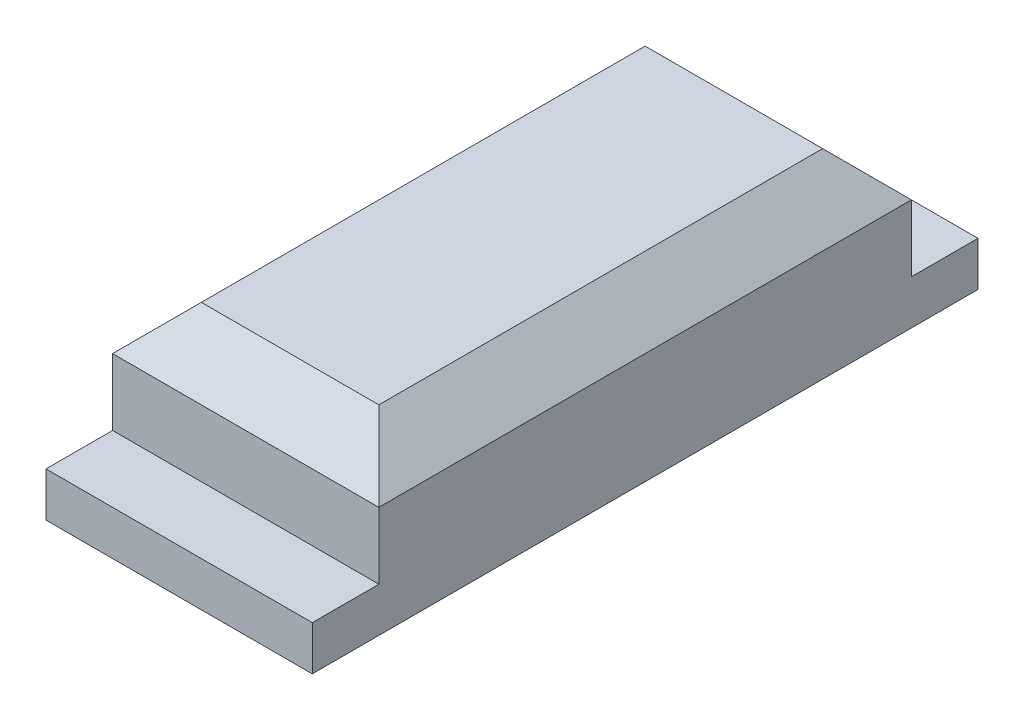
ISO-10303-21;
HEADER;
FILE_DESCRIPTION(('STEP AP214'),'2;1');
FILE_NAME('part.step','',(''),(''),'','','');
FILE_SCHEMA(('AUTOMOTIVE_DESIGN { 1 0 10303 214 1 1 1 1 }'));
ENDSEC;
DATA;
#1=APPLICATION_CONTEXT('core data for automotive mechanical design processes');
#2=APPLICATION_PROTOCOL_DEFINITION('international standard','automotive_design',2000,#1);
#3=PRODUCT_CONTEXT('',#1,'mechanical');
#4=PRODUCT('Part','Part','',(#3));
#5=PRODUCT_RELATED_PRODUCT_CATEGORY('part','',(#4));
#6=PRODUCT_DEFINITION_FORMATION('','',#4);
#7=PRODUCT_DEFINITION_CONTEXT('part definition',#1,'design');
#8=PRODUCT_DEFINITION('design','',#6,#7);
#9=PRODUCT_DEFINITION_SHAPE('','',#8);
#10=(LENGTH_UNIT() NAMED_UNIT(*) SI_UNIT(.MILLI.,.METRE.));
#11=(NAMED_UNIT(*) PLANE_ANGLE_UNIT() SI_UNIT($,.RADIAN.));
#12=(NAMED_UNIT(*) SI_UNIT($,.STERADIAN.) SOLID_ANGLE_UNIT());
#13=UNCERTAINTY_MEASURE_WITH_UNIT(LENGTH_MEASURE(1.E-05),#10,'distance_accuracy_value','');
#14=(GEOMETRIC_REPRESENTATION_CONTEXT(3) GLOBAL_UNCERTAINTY_ASSIGNED_CONTEXT((#13)) GLOBAL_UNIT_ASSIGNED_CONTEXT((#10,
#11,#12)) REPRESENTATION_CONTEXT('',''));
#15=CARTESIAN_POINT('',(0.,0.,0.));
#16=DIRECTION('',(0.,0.,1.));
#17=DIRECTION('',(1.,0.,0.));
#18=AXIS2_PLACEMENT_3D('',#15,#16,#17);
#19=CARTESIAN_POINT('',(0.,2.,0.));
#20=DIRECTION('',(0.,-1.,0.));
#21=DIRECTION('',(0.,0.,-1.));
#22=AXIS2_PLACEMENT_3D('',#19,#20,#21);
#23=PLANE('',#22);
#24=DIRECTION('',(-1.,0.,0.));
#25=VECTOR('',#24,1.);
#26=CARTESIAN_POINT('',(0.,2.,-27.));
#27=LINE('',#26,#25);
#28=CARTESIAN_POINT('',(12.,2.,-27.));
#29=VERTEX_POINT('',#28);
#30=CARTESIAN_POINT('',(0.,2.,-27.));
#31=VERTEX_POINT('',#30);
#32=EDGE_CURVE('E149',#29,#31,#27,.T.);
#33=ORIENTED_EDGE('',*,*,#32,.F.);
#34=DIRECTION('',(0.,0.,-1.));
#35=VECTOR('',#34,1.);
#36=CARTESIAN_POINT('',(12.,2.,0.));
#37=LINE('',#36,#35);
#38=CARTESIAN_POINT('',(12.,2.,-30.));
#39=VERTEX_POINT('',#38);
#40=EDGE_CURVE('E145',#29,#39,#37,.T.);
#41=ORIENTED_EDGE('',*,*,#40,.T.);
#42=DIRECTION('',(-1.,0.,0.));
#43=VECTOR('',#42,1.);
#44=CARTESIAN_POINT('',(0.,2.,-30.));
#45=LINE('',#44,#43);
#46=CARTESIAN_POINT('',(0.,2.,-30.));
#47=VERTEX_POINT('',#46);
#48=EDGE_CURVE('E144',#39,#47,#45,.T.);
#49=ORIENTED_EDGE('',*,*,#48,.T.);
#50=DIRECTION('',(0.,0.,1.));
#51=VECTOR('',#50,1.);
#52=CARTESIAN_POINT('',(0.,2.,0.));
#53=LINE('',#52,#51);
#54=EDGE_CURVE('E166',#47,#31,#53,.T.);
#55=ORIENTED_EDGE('',*,*,#54,.T.);
#56=EDGE_LOOP('',(#33,#41,#49,#55));
#57=FACE_BOUND('',#56,.T.);
#58=ADVANCED_FACE('F47',(#57),#23,.F.);
#59=DIRECTION('',(1.,0.,0.));
#60=VECTOR('',#59,1.);
#61=CARTESIAN_POINT('',(0.,2.,-3.));
#62=LINE('',#61,#60);
#63=CARTESIAN_POINT('',(0.,2.,-3.));
#64=VERTEX_POINT('',#63);
#65=CARTESIAN_POINT('',(12.,2.,-3.));
#66=VERTEX_POINT('',#65);
#67=EDGE_CURVE('E138',#64,#66,#62,.T.);
#68=ORIENTED_EDGE('',*,*,#67,.F.);
#69=CARTESIAN_POINT('',(0.,2.,0.));
#70=VERTEX_POINT('',#69);
#71=EDGE_CURVE('E170',#64,#70,#53,.T.);
#72=ORIENTED_EDGE('',*,*,#71,.T.);
#73=DIRECTION('',(1.,0.,0.));
#74=VECTOR('',#73,1.);
#75=CARTESIAN_POINT('',(0.,2.,0.));
#76=LINE('',#75,#74);
#77=CARTESIAN_POINT('',(12.,2.,0.));
#78=VERTEX_POINT('',#77);
#79=EDGE_CURVE('E141',#70,#78,#76,.T.);
#80=ORIENTED_EDGE('',*,*,#79,.T.);
#81=EDGE_CURVE('E129',#78,#66,#37,.T.);
#82=ORIENTED_EDGE('',*,*,#81,.T.);
#83=EDGE_LOOP('',(#68,#72,#80,#82));
#84=FACE_BOUND('',#83,.T.);
#85=ADVANCED_FACE('F137',(#84),#23,.F.);
#86=CARTESIAN_POINT('',(0.,2.,0.));
#87=DIRECTION('',(1.,0.,0.));
#88=DIRECTION('',(0.,0.,-1.));
#89=AXIS2_PLACEMENT_3D('',#86,#87,#88);
#90=PLANE('',#89);
#91=DIRECTION('',(0.,-1.,0.));
#92=VECTOR('',#91,1.);
#93=CARTESIAN_POINT('',(0.,7.,-3.));
#94=LINE('',#93,#92);
#95=CARTESIAN_POINT('',(0.,5.,-3.));
#96=VERTEX_POINT('',#95);
#97=EDGE_CURVE('E132',#96,#64,#94,.T.);
#98=ORIENTED_EDGE('',*,*,#97,.F.);
#99=DIRECTION('',(0.,0.,-1.));
#100=VECTOR('',#99,1.);
#101=CARTESIAN_POINT('',(0.,5.,-27.));
#102=LINE('',#101,#100);
#103=CARTESIAN_POINT('',(0.,5.,-27.));
#104=VERTEX_POINT('',#103);
#105=EDGE_CURVE('E11',#96,#104,#102,.T.);
#106=ORIENTED_EDGE('',*,*,#105,.T.);
#107=DIRECTION('',(0.,-1.,0.));
#108=VECTOR('',#107,1.);
#109=CARTESIAN_POINT('',(0.,7.,-27.));
#110=LINE('',#109,#108);
#111=EDGE_CURVE('E154',#104,#31,#110,.T.);
#112=ORIENTED_EDGE('',*,*,#111,.T.);
#113=ORIENTED_EDGE('',*,*,#54,.F.);
#114=DIRECTION('',(0.,-1.,0.));
#115=VECTOR('',#114,1.);
#116=CARTESIAN_POINT('',(0.,2.,-30.));
#117=LINE('',#116,#115);
#118=CARTESIAN_POINT('',(0.,0.,-30.));
#119=VERTEX_POINT('',#118);
#120=EDGE_CURVE('E175',#47,#119,#117,.T.);
#121=ORIENTED_EDGE('',*,*,#120,.T.);
#122=DIRECTION('',(0.,0.,1.));
#123=VECTOR('',#122,1.);
#124=CARTESIAN_POINT('',(0.,0.,0.));
#125=LINE('',#124,#123);
#126=CARTESIAN_POINT('',(0.,0.,0.));
#127=VERTEX_POINT('',#126);
#128=EDGE_CURVE('E165',#119,#127,#125,.T.);
#129=ORIENTED_EDGE('',*,*,#128,.T.);
#130=DIRECTION('',(0.,-1.,0.));
#131=VECTOR('',#130,1.);
#132=CARTESIAN_POINT('',(0.,2.,0.));
#133=LINE('',#132,#131);
#134=EDGE_CURVE('E198',#70,#127,#133,.T.);
#135=ORIENTED_EDGE('',*,*,#134,.F.);
#136=ORIENTED_EDGE('',*,*,#71,.F.);
#137=EDGE_LOOP('',(#98,#106,#112,#113,#121,#129,#135,#136));
#138=FACE_BOUND('',#137,.T.);
#139=ADVANCED_FACE('F261',(#138),#90,.F.);
#140=CARTESIAN_POINT('',(0.,2.,0.));
#141=DIRECTION('',(0.,0.,-1.));
#142=DIRECTION('',(-1.,0.,0.));
#143=AXIS2_PLACEMENT_3D('',#140,#141,#142);
#144=PLANE('',#143);
#145=DIRECTION('',(1.,0.,0.));
#146=VECTOR('',#145,1.);
#147=CARTESIAN_POINT('',(0.,0.,0.));
#148=LINE('',#147,#146);
#149=CARTESIAN_POINT('',(12.,0.,0.));
#150=VERTEX_POINT('',#149);
#151=EDGE_CURVE('E179',#127,#150,#148,.T.);
#152=ORIENTED_EDGE('',*,*,#151,.T.);
#153=DIRECTION('',(0.,-1.,0.));
#154=VECTOR('',#153,1.);
#155=CARTESIAN_POINT('',(12.,2.,0.));
#156=LINE('',#155,#154);
#157=EDGE_CURVE('E195',#78,#150,#156,.T.);
#158=ORIENTED_EDGE('',*,*,#157,.F.);
#159=ORIENTED_EDGE('',*,*,#79,.F.);
#160=ORIENTED_EDGE('',*,*,#134,.T.);
#161=EDGE_LOOP('',(#152,#158,#159,#160));
#162=FACE_BOUND('',#161,.T.);
#163=ADVANCED_FACE('F260',(#162),#144,.F.);
#164=CARTESIAN_POINT('',(12.,2.,0.));
#165=DIRECTION('',(-1.,0.,0.));
#166=DIRECTION('',(0.,0.,1.));
#167=AXIS2_PLACEMENT_3D('',#164,#165,#166);
#168=PLANE('',#167);
#169=DIRECTION('',(0.,-1.,0.));
#170=VECTOR('',#169,1.);
#171=CARTESIAN_POINT('',(12.,7.,-27.));
#172=LINE('',#171,#170);
#173=CARTESIAN_POINT('',(12.,5.,-27.));
#174=VERTEX_POINT('',#173);
#175=EDGE_CURVE('E133',#174,#29,#172,.T.);
#176=ORIENTED_EDGE('',*,*,#175,.F.);
#177=DIRECTION('',(0.,0.,1.));
#178=VECTOR('',#177,1.);
#179=CARTESIAN_POINT('',(12.,5.,-3.));
#180=LINE('',#179,#178);
#181=CARTESIAN_POINT('',(12.,5.,-3.));
#182=VERTEX_POINT('',#181);
#183=EDGE_CURVE('E73',#174,#182,#180,.T.);
#184=ORIENTED_EDGE('',*,*,#183,.T.);
#185=DIRECTION('',(0.,-1.,0.));
#186=VECTOR('',#185,1.);
#187=CARTESIAN_POINT('',(12.,7.,-3.));
#188=LINE('',#187,#186);
#189=EDGE_CURVE('E125',#182,#66,#188,.T.);
#190=ORIENTED_EDGE('',*,*,#189,.T.);
#191=ORIENTED_EDGE('',*,*,#81,.F.);
#192=ORIENTED_EDGE('',*,*,#157,.T.);
#193=DIRECTION('',(0.,0.,-1.));
#194=VECTOR('',#193,1.);
#195=CARTESIAN_POINT('',(12.,0.,0.));
#196=LINE('',#195,#194);
#197=CARTESIAN_POINT('',(12.,0.,-30.));
#198=VERTEX_POINT('',#197);
#199=EDGE_CURVE('E182',#150,#198,#196,.T.);
#200=ORIENTED_EDGE('',*,*,#199,.T.);
#201=DIRECTION('',(0.,-1.,0.));
#202=VECTOR('',#201,1.);
#203=CARTESIAN_POINT('',(12.,2.,-30.));
#204=LINE('',#203,#202);
#205=EDGE_CURVE('E191',#39,#198,#204,.T.);
#206=ORIENTED_EDGE('',*,*,#205,.F.);
#207=ORIENTED_EDGE('',*,*,#40,.F.);
#208=EDGE_LOOP('',(#176,#184,#190,#191,#192,#200,#206,#207));
#209=FACE_BOUND('',#208,.T.);
#210=ADVANCED_FACE('F127',(#209),#168,.F.);
#211=CARTESIAN_POINT('',(0.,2.,-30.));
#212=DIRECTION('',(0.,0.,1.));
#213=DIRECTION('',(1.,0.,0.));
#214=AXIS2_PLACEMENT_3D('',#211,#212,#213);
#215=PLANE('',#214);
#216=DIRECTION('',(-1.,0.,0.));
#217=VECTOR('',#216,1.);
#218=CARTESIAN_POINT('',(0.,0.,-30.));
#219=LINE('',#218,#217);
#220=EDGE_CURVE('E185',#198,#119,#219,.T.);
#221=ORIENTED_EDGE('',*,*,#220,.T.);
#222=ORIENTED_EDGE('',*,*,#120,.F.);
#223=ORIENTED_EDGE('',*,*,#48,.F.);
#224=ORIENTED_EDGE('',*,*,#205,.T.);
#225=EDGE_LOOP('',(#221,#222,#223,#224));
#226=FACE_BOUND('',#225,.T.);
#227=ADVANCED_FACE('F270',(#226),#215,.F.);
#228=CARTESIAN_POINT('',(0.,0.,0.));
#229=DIRECTION('',(0.,-1.,0.));
#230=DIRECTION('',(0.,0.,-1.));
#231=AXIS2_PLACEMENT_3D('',#228,#229,#230);
#232=PLANE('',#231);
#233=ORIENTED_EDGE('',*,*,#128,.F.);
#234=ORIENTED_EDGE('',*,*,#220,.F.);
#235=ORIENTED_EDGE('',*,*,#199,.F.);
#236=ORIENTED_EDGE('',*,*,#151,.F.);
#237=EDGE_LOOP('',(#233,#234,#235,#236));
#238=FACE_BOUND('',#237,.T.);
#239=ADVANCED_FACE('F267',(#238),#232,.T.);
#240=CARTESIAN_POINT('',(0.,7.,-3.));
#241=DIRECTION('',(0.,0.,-1.));
#242=DIRECTION('',(-1.,0.,0.));
#243=AXIS2_PLACEMENT_3D('',#240,#241,#242);
#244=PLANE('',#243);
#245=ORIENTED_EDGE('',*,*,#189,.F.);
#246=DIRECTION('',(-1.,0.,0.));
#247=VECTOR('',#246,1.);
#248=CARTESIAN_POINT('',(0.,5.,-3.));
#249=LINE('',#248,#247);
#250=EDGE_CURVE('E58',#182,#96,#249,.T.);
#251=ORIENTED_EDGE('',*,*,#250,.T.);
#252=ORIENTED_EDGE('',*,*,#97,.T.);
#253=ORIENTED_EDGE('',*,*,#67,.T.);
#254=EDGE_LOOP('',(#245,#251,#252,#253));
#255=FACE_BOUND('',#254,.T.);
#256=ADVANCED_FACE('F147',(#255),#244,.F.);
#257=CARTESIAN_POINT('',(0.,7.,-27.));
#258=DIRECTION('',(0.,0.,1.));
#259=DIRECTION('',(1.,0.,0.));
#260=AXIS2_PLACEMENT_3D('',#257,#258,#259);
#261=PLANE('',#260);
#262=ORIENTED_EDGE('',*,*,#111,.F.);
#263=DIRECTION('',(1.,0.,0.));
#264=VECTOR('',#263,1.);
#265=CARTESIAN_POINT('',(12.,5.,-27.));
#266=LINE('',#265,#264);
#267=EDGE_CURVE('E215',#104,#174,#266,.T.);
#268=ORIENTED_EDGE('',*,*,#267,.T.);
#269=ORIENTED_EDGE('',*,*,#175,.T.);
#270=ORIENTED_EDGE('',*,*,#32,.T.);
#271=EDGE_LOOP('',(#262,#268,#269,#270));
#272=FACE_BOUND('',#271,.T.);
#273=ADVANCED_FACE('F249',(#272),#261,.F.);
#274=CARTESIAN_POINT('',(0.,7.,0.));
#275=DIRECTION('',(0.,1.,0.));
#276=DIRECTION('',(0.,0.,1.));
#277=AXIS2_PLACEMENT_3D('',#274,#275,#276);
#278=PLANE('',#277);
#279=DIRECTION('',(0.,0.,-1.));
#280=VECTOR('',#279,1.);
#281=CARTESIAN_POINT('',(10.,7.,-27.));
#282=LINE('',#281,#280);
#283=CARTESIAN_POINT('',(10.,7.,-4.99999999999999));
#284=VERTEX_POINT('',#283);
#285=CARTESIAN_POINT('',(10.,7.,-25.));
#286=VERTEX_POINT('',#285);
#287=EDGE_CURVE('E208',#284,#286,#282,.T.);
#288=ORIENTED_EDGE('',*,*,#287,.T.);
#289=DIRECTION('',(-1.,0.,0.));
#290=VECTOR('',#289,1.);
#291=CARTESIAN_POINT('',(0.,7.,-25.));
#292=LINE('',#291,#290);
#293=CARTESIAN_POINT('',(1.99999999999999,7.,-25.));
#294=VERTEX_POINT('',#293);
#295=EDGE_CURVE('E211',#286,#294,#292,.T.);
#296=ORIENTED_EDGE('',*,*,#295,.T.);
#297=DIRECTION('',(0.,0.,1.));
#298=VECTOR('',#297,1.);
#299=CARTESIAN_POINT('',(1.99999999999999,7.,-3.));
#300=LINE('',#299,#298);
#301=CARTESIAN_POINT('',(1.99999999999999,7.,-4.99999999999999));
#302=VERTEX_POINT('',#301);
#303=EDGE_CURVE('E202',#294,#302,#300,.T.);
#304=ORIENTED_EDGE('',*,*,#303,.T.);
#305=DIRECTION('',(1.,0.,0.));
#306=VECTOR('',#305,1.);
#307=CARTESIAN_POINT('',(12.,7.,-4.99999999999999));
#308=LINE('',#307,#306);
#309=EDGE_CURVE('E205',#302,#284,#308,.T.);
#310=ORIENTED_EDGE('',*,*,#309,.T.);
#311=EDGE_LOOP('',(#288,#296,#304,#310));
#312=FACE_BOUND('',#311,.T.);
#313=ADVANCED_FACE('F241',(#312),#278,.T.);
#314=CARTESIAN_POINT('',(0.,7.,-4.99999999999999));
#315=DIRECTION('',(0.,0.707106781186546,0.707106781186549));
#316=DIRECTION('',(-1.,0.,0.));
#317=AXIS2_PLACEMENT_3D('',#314,#315,#316);
#318=PLANE('',#317);
#319=DIRECTION('',(0.577350269189625,0.577350269189627,-0.577350269189625));
#320=VECTOR('',#319,1.);
#321=CARTESIAN_POINT('',(0.333333333333334,5.33333333333333,-3.33333333333333));
#322=LINE('',#321,#320);
#323=EDGE_CURVE('E157',#96,#302,#322,.T.);
#324=ORIENTED_EDGE('',*,*,#323,.F.);
#325=ORIENTED_EDGE('',*,*,#250,.F.);
#326=DIRECTION('',(-0.577350269189625,0.577350269189627,-0.577350269189625));
#327=VECTOR('',#326,1.);
#328=CARTESIAN_POINT('',(6.66666666666668,10.3333333333333,-8.33333333333332));
#329=LINE('',#328,#327);
#330=EDGE_CURVE('E52',#284,#182,#329,.F.);
#331=ORIENTED_EDGE('',*,*,#330,.F.);
#332=ORIENTED_EDGE('',*,*,#309,.F.);
#333=EDGE_LOOP('',(#324,#325,#331,#332));
#334=FACE_BOUND('',#333,.T.);
#335=ADVANCED_FACE('F50',(#334),#318,.T.);
#336=CARTESIAN_POINT('',(10.,7.,0.));
#337=DIRECTION('',(0.707106781186549,0.707106781186546,0.));
#338=DIRECTION('',(0.,0.,1.));
#339=AXIS2_PLACEMENT_3D('',#336,#337,#338);
#340=PLANE('',#339);
#341=ORIENTED_EDGE('',*,*,#330,.T.);
#342=ORIENTED_EDGE('',*,*,#183,.F.);
#343=DIRECTION('',(-0.577350269189625,0.577350269189627,0.577350269189626));
#344=VECTOR('',#343,1.);
#345=CARTESIAN_POINT('',(1.66666666666669,15.3333333333333,-16.6666666666667));
#346=LINE('',#345,#344);
#347=EDGE_CURVE('E226',#286,#174,#346,.F.);
#348=ORIENTED_EDGE('',*,*,#347,.F.);
#349=ORIENTED_EDGE('',*,*,#287,.F.);
#350=EDGE_LOOP('',(#341,#342,#348,#349));
#351=FACE_BOUND('',#350,.T.);
#352=ADVANCED_FACE('F299',(#351),#340,.T.);
#353=CARTESIAN_POINT('',(1.99999999999999,7.,0.));
#354=DIRECTION('',(-0.707106781186549,0.707106781186546,0.));
#355=DIRECTION('',(0.,0.,-1.));
#356=AXIS2_PLACEMENT_3D('',#353,#354,#355);
#357=PLANE('',#356);
#358=ORIENTED_EDGE('',*,*,#323,.T.);
#359=ORIENTED_EDGE('',*,*,#303,.F.);
#360=DIRECTION('',(-0.577350269189625,-0.577350269189627,-0.577350269189626));
#361=VECTOR('',#360,1.);
#362=CARTESIAN_POINT('',(10.3333333333333,15.3333333333333,-16.6666666666667));
#363=LINE('',#362,#361);
#364=EDGE_CURVE('E223',#104,#294,#363,.F.);
#365=ORIENTED_EDGE('',*,*,#364,.F.);
#366=ORIENTED_EDGE('',*,*,#105,.F.);
#367=EDGE_LOOP('',(#358,#359,#365,#366));
#368=FACE_BOUND('',#367,.T.);
#369=ADVANCED_FACE('F234',(#368),#357,.T.);
#370=CARTESIAN_POINT('',(0.,7.,-25.));
#371=DIRECTION('',(0.,0.707106781186547,-0.707106781186548));
#372=DIRECTION('',(1.,0.,0.));
#373=AXIS2_PLACEMENT_3D('',#370,#371,#372);
#374=PLANE('',#373);
#375=ORIENTED_EDGE('',*,*,#347,.T.);
#376=ORIENTED_EDGE('',*,*,#267,.F.);
#377=ORIENTED_EDGE('',*,*,#364,.T.);
#378=ORIENTED_EDGE('',*,*,#295,.F.);
#379=EDGE_LOOP('',(#375,#376,#377,#378));
#380=FACE_BOUND('',#379,.T.);
#381=ADVANCED_FACE('F245',(#380),#374,.T.);
#382=CLOSED_SHELL('',(#58,#85,#139,#163,#210,#227,#239,#256,#273,#313,#335,#352,#369,#381));
#383=MANIFOLD_SOLID_BREP('B2',#382);
#384=ADVANCED_BREP_SHAPE_REPRESENTATION('',(#18,#383),#14);
#385=SHAPE_DEFINITION_REPRESENTATION(#9,#384);
ENDSEC;
END-ISO-10303-21;
